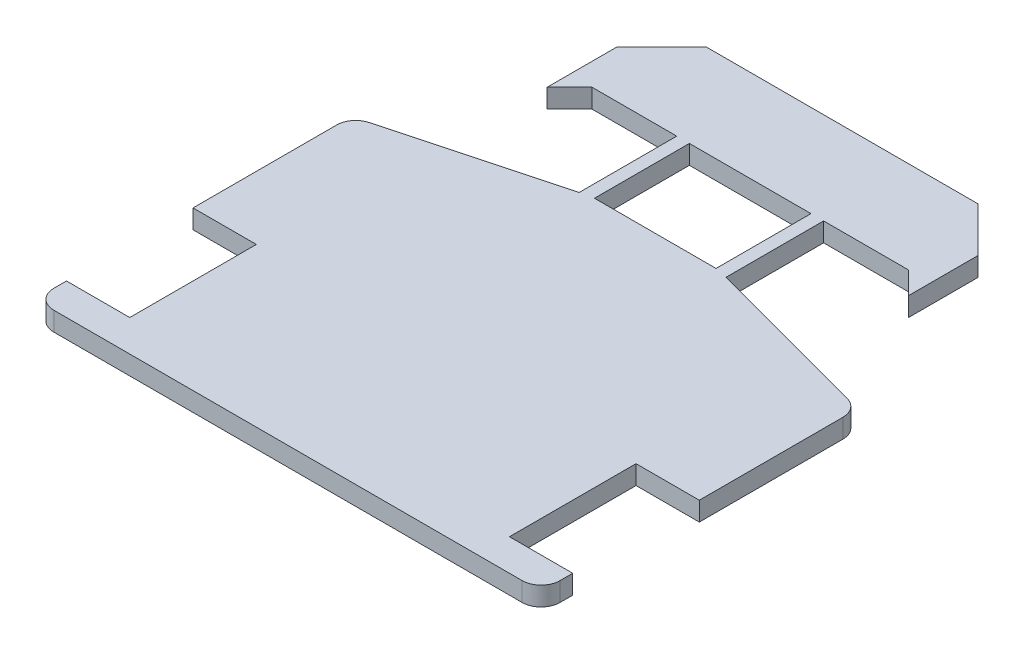
ISO-10303-21;
HEADER;
FILE_DESCRIPTION(('STEP AP214'),'2;1');
FILE_NAME('part.step','',(''),(''),'','','');
FILE_SCHEMA(('AUTOMOTIVE_DESIGN { 1 0 10303 214 1 1 1 1 }'));
ENDSEC;
DATA;
#1=APPLICATION_CONTEXT('core data for automotive mechanical design processes');
#2=APPLICATION_PROTOCOL_DEFINITION('international standard','automotive_design',2000,#1);
#3=PRODUCT_CONTEXT('',#1,'mechanical');
#4=PRODUCT('Part','Part','',(#3));
#5=PRODUCT_RELATED_PRODUCT_CATEGORY('part','',(#4));
#6=PRODUCT_DEFINITION_FORMATION('','',#4);
#7=PRODUCT_DEFINITION_CONTEXT('part definition',#1,'design');
#8=PRODUCT_DEFINITION('design','',#6,#7);
#9=PRODUCT_DEFINITION_SHAPE('','',#8);
#10=(LENGTH_UNIT() NAMED_UNIT(*) SI_UNIT(.MILLI.,.METRE.));
#11=(NAMED_UNIT(*) PLANE_ANGLE_UNIT() SI_UNIT($,.RADIAN.));
#12=(NAMED_UNIT(*) SI_UNIT($,.STERADIAN.) SOLID_ANGLE_UNIT());
#13=UNCERTAINTY_MEASURE_WITH_UNIT(LENGTH_MEASURE(1.E-05),#10,'distance_accuracy_value','');
#14=(GEOMETRIC_REPRESENTATION_CONTEXT(3) GLOBAL_UNCERTAINTY_ASSIGNED_CONTEXT((#13)) GLOBAL_UNIT_ASSIGNED_CONTEXT((#10,
#11,#12)) REPRESENTATION_CONTEXT('',''));
#15=CARTESIAN_POINT('',(0.,0.,0.));
#16=DIRECTION('',(0.,0.,1.));
#17=DIRECTION('',(1.,0.,0.));
#18=AXIS2_PLACEMENT_3D('',#15,#16,#17);
#19=CARTESIAN_POINT('',(15.1794919243108,3.,-56.6506350946109));
#20=DIRECTION('',(-0.258819045102514,0.,0.96592582628907));
#21=DIRECTION('',(0.96592582628907,0.,0.258819045102514));
#22=AXIS2_PLACEMENT_3D('',#19,#20,#21);
#23=PLANE('',#22);
#24=DIRECTION('',(0.,1.,0.));
#25=VECTOR('',#24,1.);
#26=CARTESIAN_POINT('',(11.6050425072378,0.,-57.6084059293014));
#27=LINE('',#26,#25);
#28=CARTESIAN_POINT('',(11.6050425072378,0.,-57.6084059293014));
#29=VERTEX_POINT('',#28);
#30=CARTESIAN_POINT('',(11.6050425072378,3.,-57.6084059293014));
#31=VERTEX_POINT('',#30);
#32=EDGE_CURVE('E395',#29,#31,#27,.T.);
#33=ORIENTED_EDGE('',*,*,#32,.T.);
#34=DIRECTION('',(-0.96592582628907,0.,-0.258819045102514));
#35=VECTOR('',#34,1.);
#36=CARTESIAN_POINT('',(15.1794919243108,3.,-56.6506350946109));
#37=LINE('',#36,#35);
#38=CARTESIAN_POINT('',(37.7764571353075,3.,-50.5957965149303));
#39=VERTEX_POINT('',#38);
#40=EDGE_CURVE('E432',#39,#31,#37,.T.);
#41=ORIENTED_EDGE('',*,*,#40,.F.);
#42=DIRECTION('',(0.,-1.,0.));
#43=VECTOR('',#42,1.);
#44=CARTESIAN_POINT('',(37.7764571353075,3.,-50.5957965149303));
#45=LINE('',#44,#43);
#46=CARTESIAN_POINT('',(37.7764571353075,0.,-50.5957965149303));
#47=VERTEX_POINT('',#46);
#48=EDGE_CURVE('E564',#39,#47,#45,.T.);
#49=ORIENTED_EDGE('',*,*,#48,.T.);
#50=DIRECTION('',(-0.96592582628907,0.,-0.258819045102514));
#51=VECTOR('',#50,1.);
#52=CARTESIAN_POINT('',(15.1794919243108,0.,-56.6506350946109));
#53=LINE('',#52,#51);
#54=EDGE_CURVE('E495',#47,#29,#53,.T.);
#55=ORIENTED_EDGE('',*,*,#54,.T.);
#56=EDGE_LOOP('',(#33,#41,#49,#55));
#57=FACE_BOUND('',#56,.T.);
#58=ADVANCED_FACE('F41',(#57),#23,.F.);
#59=CARTESIAN_POINT('',(0.,3.,0.));
#60=DIRECTION('',(0.,0.,-1.));
#61=DIRECTION('',(-1.,0.,0.));
#62=AXIS2_PLACEMENT_3D('',#59,#60,#61);
#63=PLANE('',#62);
#64=DIRECTION('',(1.,0.,0.));
#65=VECTOR('',#64,1.);
#66=CARTESIAN_POINT('',(0.,0.,0.));
#67=LINE('',#66,#65);
#68=CARTESIAN_POINT('',(-37.,0.,0.));
#69=VERTEX_POINT('',#68);
#70=CARTESIAN_POINT('',(37.,0.,0.));
#71=VERTEX_POINT('',#70);
#72=EDGE_CURVE('E399',#69,#71,#67,.T.);
#73=ORIENTED_EDGE('',*,*,#72,.T.);
#74=DIRECTION('',(0.,-1.,0.));
#75=VECTOR('',#74,1.);
#76=CARTESIAN_POINT('',(37.,3.,0.));
#77=LINE('',#76,#75);
#78=CARTESIAN_POINT('',(37.,3.,0.));
#79=VERTEX_POINT('',#78);
#80=EDGE_CURVE('E11',#79,#71,#77,.T.);
#81=ORIENTED_EDGE('',*,*,#80,.F.);
#82=DIRECTION('',(1.,0.,0.));
#83=VECTOR('',#82,1.);
#84=CARTESIAN_POINT('',(0.,3.,0.));
#85=LINE('',#84,#83);
#86=CARTESIAN_POINT('',(-37.,3.,0.));
#87=VERTEX_POINT('',#86);
#88=EDGE_CURVE('E406',#87,#79,#85,.T.);
#89=ORIENTED_EDGE('',*,*,#88,.F.);
#90=DIRECTION('',(0.,-1.,0.));
#91=VECTOR('',#90,1.);
#92=CARTESIAN_POINT('',(-37.,3.,0.));
#93=LINE('',#92,#91);
#94=EDGE_CURVE('E470',#87,#69,#93,.T.);
#95=ORIENTED_EDGE('',*,*,#94,.T.);
#96=EDGE_LOOP('',(#73,#81,#89,#95));
#97=FACE_BOUND('',#96,.T.);
#98=ADVANCED_FACE('F43',(#97),#63,.F.);
#99=CARTESIAN_POINT('',(37.,3.,-3.));
#100=DIRECTION('',(0.,-1.,0.));
#101=DIRECTION('',(0.,0.,-1.));
#102=AXIS2_PLACEMENT_3D('',#99,#100,#101);
#103=CYLINDRICAL_SURFACE('',#102,3.);
#104=CARTESIAN_POINT('',(37.,0.,-3.));
#105=DIRECTION('',(0.,1.,0.));
#106=DIRECTION('',(0.,0.,1.));
#107=AXIS2_PLACEMENT_3D('',#104,#105,#106);
#108=CIRCLE('',#107,3.);
#109=CARTESIAN_POINT('',(40.,0.,-3.00000000000002));
#110=VERTEX_POINT('',#109);
#111=EDGE_CURVE('E474',#71,#110,#108,.T.);
#112=ORIENTED_EDGE('',*,*,#111,.T.);
#113=DIRECTION('',(0.,-1.,0.));
#114=VECTOR('',#113,1.);
#115=CARTESIAN_POINT('',(40.,3.,-3.00000000000002));
#116=LINE('',#115,#114);
#117=CARTESIAN_POINT('',(40.,3.,-3.00000000000002));
#118=VERTEX_POINT('',#117);
#119=EDGE_CURVE('E50',#118,#110,#116,.T.);
#120=ORIENTED_EDGE('',*,*,#119,.F.);
#121=CARTESIAN_POINT('',(37.,3.,-3.));
#122=DIRECTION('',(0.,1.,0.));
#123=DIRECTION('',(0.,0.,1.));
#124=AXIS2_PLACEMENT_3D('',#121,#122,#123);
#125=CIRCLE('',#124,3.);
#126=EDGE_CURVE('E410',#79,#118,#125,.T.);
#127=ORIENTED_EDGE('',*,*,#126,.F.);
#128=ORIENTED_EDGE('',*,*,#80,.T.);
#129=EDGE_LOOP('',(#112,#120,#127,#128));
#130=FACE_BOUND('',#129,.T.);
#131=ADVANCED_FACE('F616',(#130),#103,.T.);
#132=CARTESIAN_POINT('',(40.,3.,0.));
#133=DIRECTION('',(-1.,0.,0.));
#134=DIRECTION('',(0.,0.,1.));
#135=AXIS2_PLACEMENT_3D('',#132,#133,#134);
#136=PLANE('',#135);
#137=DIRECTION('',(0.,0.,-1.));
#138=VECTOR('',#137,1.);
#139=CARTESIAN_POINT('',(40.,0.,0.));
#140=LINE('',#139,#138);
#141=CARTESIAN_POINT('',(40.,0.,-5.));
#142=VERTEX_POINT('',#141);
#143=EDGE_CURVE('E477',#110,#142,#140,.T.);
#144=ORIENTED_EDGE('',*,*,#143,.T.);
#145=DIRECTION('',(0.,-1.,0.));
#146=VECTOR('',#145,1.);
#147=CARTESIAN_POINT('',(40.,3.,-5.));
#148=LINE('',#147,#146);
#149=CARTESIAN_POINT('',(40.,3.,-5.));
#150=VERTEX_POINT('',#149);
#151=EDGE_CURVE('E584',#150,#142,#148,.T.);
#152=ORIENTED_EDGE('',*,*,#151,.F.);
#153=DIRECTION('',(0.,0.,-1.));
#154=VECTOR('',#153,1.);
#155=CARTESIAN_POINT('',(40.,3.,0.));
#156=LINE('',#155,#154);
#157=EDGE_CURVE('E414',#118,#150,#156,.T.);
#158=ORIENTED_EDGE('',*,*,#157,.F.);
#159=ORIENTED_EDGE('',*,*,#119,.T.);
#160=EDGE_LOOP('',(#144,#152,#158,#159));
#161=FACE_BOUND('',#160,.T.);
#162=ADVANCED_FACE('F593',(#161),#136,.F.);
#163=CARTESIAN_POINT('',(0.,3.,-4.99999999999999));
#164=DIRECTION('',(0.,0.,1.));
#165=DIRECTION('',(1.,0.,0.));
#166=AXIS2_PLACEMENT_3D('',#163,#164,#165);
#167=PLANE('',#166);
#168=DIRECTION('',(-1.,0.,0.));
#169=VECTOR('',#168,1.);
#170=CARTESIAN_POINT('',(0.,0.,-4.99999999999999));
#171=LINE('',#170,#169);
#172=CARTESIAN_POINT('',(30.,0.,-4.99999999999999));
#173=VERTEX_POINT('',#172);
#174=EDGE_CURVE('E480',#142,#173,#171,.T.);
#175=ORIENTED_EDGE('',*,*,#174,.T.);
#176=DIRECTION('',(0.,-1.,0.));
#177=VECTOR('',#176,1.);
#178=CARTESIAN_POINT('',(30.,3.,-4.99999999999999));
#179=LINE('',#178,#177);
#180=CARTESIAN_POINT('',(30.,3.,-4.99999999999999));
#181=VERTEX_POINT('',#180);
#182=EDGE_CURVE('E580',#181,#173,#179,.T.);
#183=ORIENTED_EDGE('',*,*,#182,.F.);
#184=DIRECTION('',(-1.,0.,0.));
#185=VECTOR('',#184,1.);
#186=CARTESIAN_POINT('',(0.,3.,-4.99999999999999));
#187=LINE('',#186,#185);
#188=EDGE_CURVE('E417',#150,#181,#187,.T.);
#189=ORIENTED_EDGE('',*,*,#188,.F.);
#190=ORIENTED_EDGE('',*,*,#151,.T.);
#191=EDGE_LOOP('',(#175,#183,#189,#190));
#192=FACE_BOUND('',#191,.T.);
#193=ADVANCED_FACE('F602',(#192),#167,.F.);
#194=CARTESIAN_POINT('',(30.,3.,0.));
#195=DIRECTION('',(-1.,0.,0.));
#196=DIRECTION('',(0.,0.,1.));
#197=AXIS2_PLACEMENT_3D('',#194,#195,#196);
#198=PLANE('',#197);
#199=DIRECTION('',(0.,0.,-1.));
#200=VECTOR('',#199,1.);
#201=CARTESIAN_POINT('',(30.,0.,0.));
#202=LINE('',#201,#200);
#203=CARTESIAN_POINT('',(30.,0.,-25.));
#204=VERTEX_POINT('',#203);
#205=EDGE_CURVE('E483',#173,#204,#202,.T.);
#206=ORIENTED_EDGE('',*,*,#205,.T.);
#207=DIRECTION('',(0.,-1.,0.));
#208=VECTOR('',#207,1.);
#209=CARTESIAN_POINT('',(30.,3.,-25.));
#210=LINE('',#209,#208);
#211=CARTESIAN_POINT('',(30.,3.,-25.));
#212=VERTEX_POINT('',#211);
#213=EDGE_CURVE('E576',#212,#204,#210,.T.);
#214=ORIENTED_EDGE('',*,*,#213,.F.);
#215=DIRECTION('',(0.,0.,-1.));
#216=VECTOR('',#215,1.);
#217=CARTESIAN_POINT('',(30.,3.,0.));
#218=LINE('',#217,#216);
#219=EDGE_CURVE('E420',#181,#212,#218,.T.);
#220=ORIENTED_EDGE('',*,*,#219,.F.);
#221=ORIENTED_EDGE('',*,*,#182,.T.);
#222=EDGE_LOOP('',(#206,#214,#220,#221));
#223=FACE_BOUND('',#222,.T.);
#224=ADVANCED_FACE('F606',(#223),#198,.F.);
#225=CARTESIAN_POINT('',(0.,3.,-25.));
#226=DIRECTION('',(0.,0.,-1.));
#227=DIRECTION('',(-1.,0.,0.));
#228=AXIS2_PLACEMENT_3D('',#225,#226,#227);
#229=PLANE('',#228);
#230=DIRECTION('',(1.,0.,0.));
#231=VECTOR('',#230,1.);
#232=CARTESIAN_POINT('',(0.,0.,-25.));
#233=LINE('',#232,#231);
#234=CARTESIAN_POINT('',(40.,0.,-25.));
#235=VERTEX_POINT('',#234);
#236=EDGE_CURVE('E486',#204,#235,#233,.T.);
#237=ORIENTED_EDGE('',*,*,#236,.T.);
#238=DIRECTION('',(0.,-1.,0.));
#239=VECTOR('',#238,1.);
#240=CARTESIAN_POINT('',(40.,3.,-25.));
#241=LINE('',#240,#239);
#242=CARTESIAN_POINT('',(40.,3.,-25.));
#243=VERTEX_POINT('',#242);
#244=EDGE_CURVE('E572',#243,#235,#241,.T.);
#245=ORIENTED_EDGE('',*,*,#244,.F.);
#246=DIRECTION('',(1.,0.,0.));
#247=VECTOR('',#246,1.);
#248=CARTESIAN_POINT('',(0.,3.,-25.));
#249=LINE('',#248,#247);
#250=EDGE_CURVE('E423',#212,#243,#249,.T.);
#251=ORIENTED_EDGE('',*,*,#250,.F.);
#252=ORIENTED_EDGE('',*,*,#213,.T.);
#253=EDGE_LOOP('',(#237,#245,#251,#252));
#254=FACE_BOUND('',#253,.T.);
#255=ADVANCED_FACE('F716',(#254),#229,.F.);
#256=CARTESIAN_POINT('',(40.,3.,0.));
#257=DIRECTION('',(-1.,0.,0.));
#258=DIRECTION('',(0.,0.,1.));
#259=AXIS2_PLACEMENT_3D('',#256,#257,#258);
#260=PLANE('',#259);
#261=DIRECTION('',(0.,0.,-1.));
#262=VECTOR('',#261,1.);
#263=CARTESIAN_POINT('',(40.,0.,0.));
#264=LINE('',#263,#262);
#265=CARTESIAN_POINT('',(40.,0.,-47.6980190360631));
#266=VERTEX_POINT('',#265);
#267=EDGE_CURVE('E489',#235,#266,#264,.T.);
#268=ORIENTED_EDGE('',*,*,#267,.T.);
#269=DIRECTION('',(0.,-1.,0.));
#270=VECTOR('',#269,1.);
#271=CARTESIAN_POINT('',(40.,3.,-47.6980190360631));
#272=LINE('',#271,#270);
#273=CARTESIAN_POINT('',(40.,3.,-47.6980190360631));
#274=VERTEX_POINT('',#273);
#275=EDGE_CURVE('E568',#274,#266,#272,.T.);
#276=ORIENTED_EDGE('',*,*,#275,.F.);
#277=DIRECTION('',(0.,0.,-1.));
#278=VECTOR('',#277,1.);
#279=CARTESIAN_POINT('',(40.,3.,0.));
#280=LINE('',#279,#278);
#281=EDGE_CURVE('E426',#243,#274,#280,.T.);
#282=ORIENTED_EDGE('',*,*,#281,.F.);
#283=ORIENTED_EDGE('',*,*,#244,.T.);
#284=EDGE_LOOP('',(#268,#276,#282,#283));
#285=FACE_BOUND('',#284,.T.);
#286=ADVANCED_FACE('F704',(#285),#260,.F.);
#287=CARTESIAN_POINT('',(37.,3.,-47.6980190360631));
#288=DIRECTION('',(0.,-1.,0.));
#289=DIRECTION('',(0.,0.,-1.));
#290=AXIS2_PLACEMENT_3D('',#287,#288,#289);
#291=CYLINDRICAL_SURFACE('',#290,3.);
#292=CARTESIAN_POINT('',(37.,0.,-47.6980190360631));
#293=DIRECTION('',(0.,1.,0.));
#294=DIRECTION('',(0.,0.,1.));
#295=AXIS2_PLACEMENT_3D('',#292,#293,#294);
#296=CIRCLE('',#295,3.);
#297=EDGE_CURVE('E492',#266,#47,#296,.T.);
#298=ORIENTED_EDGE('',*,*,#297,.T.);
#299=ORIENTED_EDGE('',*,*,#48,.F.);
#300=CARTESIAN_POINT('',(37.,3.,-47.6980190360631));
#301=DIRECTION('',(0.,1.,0.));
#302=DIRECTION('',(0.,0.,1.));
#303=AXIS2_PLACEMENT_3D('',#300,#301,#302);
#304=CIRCLE('',#303,3.);
#305=EDGE_CURVE('E429',#274,#39,#304,.T.);
#306=ORIENTED_EDGE('',*,*,#305,.F.);
#307=ORIENTED_EDGE('',*,*,#275,.T.);
#308=EDGE_LOOP('',(#298,#299,#306,#307));
#309=FACE_BOUND('',#308,.T.);
#310=ADVANCED_FACE('F697',(#309),#291,.T.);
#311=CARTESIAN_POINT('',(0.,3.,-58.0384757729335));
#312=DIRECTION('',(0.,0.,-1.));
#313=DIRECTION('',(-1.,0.,0.));
#314=AXIS2_PLACEMENT_3D('',#311,#312,#313);
#315=PLANE('',#314);
#316=DIRECTION('',(1.,0.,0.));
#317=VECTOR('',#316,1.);
#318=CARTESIAN_POINT('',(0.,0.,-58.0384757729335));
#319=LINE('',#318,#317);
#320=CARTESIAN_POINT('',(-9.60504250723781,0.,-58.0384757729335));
#321=VERTEX_POINT('',#320);
#322=CARTESIAN_POINT('',(9.60504250723781,0.,-58.0384757729335));
#323=VERTEX_POINT('',#322);
#324=EDGE_CURVE('E499',#321,#323,#319,.T.);
#325=ORIENTED_EDGE('',*,*,#324,.F.);
#326=DIRECTION('',(0.,-1.,0.));
#327=VECTOR('',#326,1.);
#328=CARTESIAN_POINT('',(-9.60504250723781,3.,-58.0384757729335));
#329=LINE('',#328,#327);
#330=CARTESIAN_POINT('',(-9.60504250723781,3.,-58.0384757729335));
#331=VERTEX_POINT('',#330);
#332=EDGE_CURVE('E556',#331,#321,#329,.T.);
#333=ORIENTED_EDGE('',*,*,#332,.F.);
#334=DIRECTION('',(1.,0.,0.));
#335=VECTOR('',#334,1.);
#336=CARTESIAN_POINT('',(0.,3.,-58.0384757729335));
#337=LINE('',#336,#335);
#338=CARTESIAN_POINT('',(9.60504250723781,3.,-58.0384757729335));
#339=VERTEX_POINT('',#338);
#340=EDGE_CURVE('E436',#331,#339,#337,.T.);
#341=ORIENTED_EDGE('',*,*,#340,.T.);
#342=DIRECTION('',(0.,-1.,0.));
#343=VECTOR('',#342,1.);
#344=CARTESIAN_POINT('',(9.60504250723781,3.,-58.0384757729335));
#345=LINE('',#344,#343);
#346=EDGE_CURVE('E560',#339,#323,#345,.T.);
#347=ORIENTED_EDGE('',*,*,#346,.T.);
#348=EDGE_LOOP('',(#325,#333,#341,#347));
#349=FACE_BOUND('',#348,.T.);
#350=ADVANCED_FACE('F695',(#349),#315,.T.);
#351=CARTESIAN_POINT('',(-15.1794919243108,3.,-56.6506350946109));
#352=DIRECTION('',(-0.258819045102514,0.,-0.96592582628907));
#353=DIRECTION('',(-0.96592582628907,0.,0.258819045102514));
#354=AXIS2_PLACEMENT_3D('',#351,#352,#353);
#355=PLANE('',#354);
#356=DIRECTION('',(0.,1.,0.));
#357=VECTOR('',#356,1.);
#358=CARTESIAN_POINT('',(-11.6050425072378,0.,-57.6084059293015));
#359=LINE('',#358,#357);
#360=CARTESIAN_POINT('',(-11.6050425072378,0.,-57.6084059293014));
#361=VERTEX_POINT('',#360);
#362=CARTESIAN_POINT('',(-11.6050425072378,3.,-57.6084059293014));
#363=VERTEX_POINT('',#362);
#364=EDGE_CURVE('E61',#361,#363,#359,.T.);
#365=ORIENTED_EDGE('',*,*,#364,.F.);
#366=DIRECTION('',(0.96592582628907,0.,-0.258819045102514));
#367=VECTOR('',#366,1.);
#368=CARTESIAN_POINT('',(-15.1794919243108,0.,-56.6506350946109));
#369=LINE('',#368,#367);
#370=CARTESIAN_POINT('',(-37.7764571353075,0.,-50.5957965149303));
#371=VERTEX_POINT('',#370);
#372=EDGE_CURVE('E503',#371,#361,#369,.T.);
#373=ORIENTED_EDGE('',*,*,#372,.F.);
#374=DIRECTION('',(0.,-1.,0.));
#375=VECTOR('',#374,1.);
#376=CARTESIAN_POINT('',(-37.7764571353075,3.,-50.5957965149303));
#377=LINE('',#376,#375);
#378=CARTESIAN_POINT('',(-37.7764571353075,3.,-50.5957965149303));
#379=VERTEX_POINT('',#378);
#380=EDGE_CURVE('E553',#379,#371,#377,.T.);
#381=ORIENTED_EDGE('',*,*,#380,.F.);
#382=DIRECTION('',(0.96592582628907,0.,-0.258819045102514));
#383=VECTOR('',#382,1.);
#384=CARTESIAN_POINT('',(-15.1794919243108,3.,-56.6506350946109));
#385=LINE('',#384,#383);
#386=EDGE_CURVE('E57',#379,#363,#385,.T.);
#387=ORIENTED_EDGE('',*,*,#386,.T.);
#388=EDGE_LOOP('',(#365,#373,#381,#387));
#389=FACE_BOUND('',#388,.T.);
#390=ADVANCED_FACE('F645',(#389),#355,.T.);
#391=CARTESIAN_POINT('',(-37.,3.,-47.6980190360631));
#392=DIRECTION('',(0.,-1.,0.));
#393=DIRECTION('',(0.,0.,-1.));
#394=AXIS2_PLACEMENT_3D('',#391,#392,#393);
#395=CYLINDRICAL_SURFACE('',#394,3.);
#396=CARTESIAN_POINT('',(-37.,0.,-47.6980190360631));
#397=DIRECTION('',(0.,1.,0.));
#398=DIRECTION('',(0.,0.,1.));
#399=AXIS2_PLACEMENT_3D('',#396,#397,#398);
#400=CIRCLE('',#399,3.);
#401=CARTESIAN_POINT('',(-40.,0.,-47.6980190360631));
#402=VERTEX_POINT('',#401);
#403=EDGE_CURVE('E506',#402,#371,#400,.F.);
#404=ORIENTED_EDGE('',*,*,#403,.F.);
#405=DIRECTION('',(0.,-1.,0.));
#406=VECTOR('',#405,1.);
#407=CARTESIAN_POINT('',(-40.,3.,-47.6980190360631));
#408=LINE('',#407,#406);
#409=CARTESIAN_POINT('',(-40.,3.,-47.6980190360631));
#410=VERTEX_POINT('',#409);
#411=EDGE_CURVE('E550',#410,#402,#408,.T.);
#412=ORIENTED_EDGE('',*,*,#411,.F.);
#413=CARTESIAN_POINT('',(-37.,3.,-47.6980190360631));
#414=DIRECTION('',(0.,1.,0.));
#415=DIRECTION('',(0.,0.,1.));
#416=AXIS2_PLACEMENT_3D('',#413,#414,#415);
#417=CIRCLE('',#416,3.);
#418=EDGE_CURVE('E442',#410,#379,#417,.F.);
#419=ORIENTED_EDGE('',*,*,#418,.T.);
#420=ORIENTED_EDGE('',*,*,#380,.T.);
#421=EDGE_LOOP('',(#404,#412,#419,#420));
#422=FACE_BOUND('',#421,.T.);
#423=ADVANCED_FACE('F644',(#422),#395,.T.);
#424=CARTESIAN_POINT('',(-40.,3.,0.));
#425=DIRECTION('',(-1.,0.,0.));
#426=DIRECTION('',(0.,0.,1.));
#427=AXIS2_PLACEMENT_3D('',#424,#425,#426);
#428=PLANE('',#427);
#429=DIRECTION('',(0.,0.,-1.));
#430=VECTOR('',#429,1.);
#431=CARTESIAN_POINT('',(-40.,0.,0.));
#432=LINE('',#431,#430);
#433=CARTESIAN_POINT('',(-40.,0.,-25.));
#434=VERTEX_POINT('',#433);
#435=EDGE_CURVE('E510',#434,#402,#432,.T.);
#436=ORIENTED_EDGE('',*,*,#435,.F.);
#437=DIRECTION('',(0.,-1.,0.));
#438=VECTOR('',#437,1.);
#439=CARTESIAN_POINT('',(-40.,3.,-25.));
#440=LINE('',#439,#438);
#441=CARTESIAN_POINT('',(-40.,3.,-25.));
#442=VERTEX_POINT('',#441);
#443=EDGE_CURVE('E547',#442,#434,#440,.T.);
#444=ORIENTED_EDGE('',*,*,#443,.F.);
#445=DIRECTION('',(0.,0.,-1.));
#446=VECTOR('',#445,1.);
#447=CARTESIAN_POINT('',(-40.,3.,0.));
#448=LINE('',#447,#446);
#449=EDGE_CURVE('E446',#442,#410,#448,.T.);
#450=ORIENTED_EDGE('',*,*,#449,.T.);
#451=ORIENTED_EDGE('',*,*,#411,.T.);
#452=EDGE_LOOP('',(#436,#444,#450,#451));
#453=FACE_BOUND('',#452,.T.);
#454=ADVANCED_FACE('F640',(#453),#428,.T.);
#455=CARTESIAN_POINT('',(0.,3.,-25.));
#456=DIRECTION('',(0.,0.,1.));
#457=DIRECTION('',(1.,0.,0.));
#458=AXIS2_PLACEMENT_3D('',#455,#456,#457);
#459=PLANE('',#458);
#460=DIRECTION('',(-1.,0.,0.));
#461=VECTOR('',#460,1.);
#462=CARTESIAN_POINT('',(0.,0.,-25.));
#463=LINE('',#462,#461);
#464=CARTESIAN_POINT('',(-30.,0.,-25.));
#465=VERTEX_POINT('',#464);
#466=EDGE_CURVE('E514',#465,#434,#463,.T.);
#467=ORIENTED_EDGE('',*,*,#466,.F.);
#468=DIRECTION('',(0.,-1.,0.));
#469=VECTOR('',#468,1.);
#470=CARTESIAN_POINT('',(-30.,3.,-25.));
#471=LINE('',#470,#469);
#472=CARTESIAN_POINT('',(-30.,3.,-25.));
#473=VERTEX_POINT('',#472);
#474=EDGE_CURVE('E544',#473,#465,#471,.T.);
#475=ORIENTED_EDGE('',*,*,#474,.F.);
#476=DIRECTION('',(-1.,0.,0.));
#477=VECTOR('',#476,1.);
#478=CARTESIAN_POINT('',(0.,3.,-25.));
#479=LINE('',#478,#477);
#480=EDGE_CURVE('E450',#473,#442,#479,.T.);
#481=ORIENTED_EDGE('',*,*,#480,.T.);
#482=ORIENTED_EDGE('',*,*,#443,.T.);
#483=EDGE_LOOP('',(#467,#475,#481,#482));
#484=FACE_BOUND('',#483,.T.);
#485=ADVANCED_FACE('F636',(#484),#459,.T.);
#486=CARTESIAN_POINT('',(-30.,3.,0.));
#487=DIRECTION('',(-1.,0.,0.));
#488=DIRECTION('',(0.,0.,1.));
#489=AXIS2_PLACEMENT_3D('',#486,#487,#488);
#490=PLANE('',#489);
#491=DIRECTION('',(0.,0.,-1.));
#492=VECTOR('',#491,1.);
#493=CARTESIAN_POINT('',(-30.,0.,0.));
#494=LINE('',#493,#492);
#495=CARTESIAN_POINT('',(-30.,0.,-4.99999999999999));
#496=VERTEX_POINT('',#495);
#497=EDGE_CURVE('E518',#496,#465,#494,.T.);
#498=ORIENTED_EDGE('',*,*,#497,.F.);
#499=DIRECTION('',(0.,-1.,0.));
#500=VECTOR('',#499,1.);
#501=CARTESIAN_POINT('',(-30.,3.,-4.99999999999999));
#502=LINE('',#501,#500);
#503=CARTESIAN_POINT('',(-30.,3.,-4.99999999999999));
#504=VERTEX_POINT('',#503);
#505=EDGE_CURVE('E541',#504,#496,#502,.T.);
#506=ORIENTED_EDGE('',*,*,#505,.F.);
#507=DIRECTION('',(0.,0.,-1.));
#508=VECTOR('',#507,1.);
#509=CARTESIAN_POINT('',(-30.,3.,0.));
#510=LINE('',#509,#508);
#511=EDGE_CURVE('E454',#504,#473,#510,.T.);
#512=ORIENTED_EDGE('',*,*,#511,.T.);
#513=ORIENTED_EDGE('',*,*,#474,.T.);
#514=EDGE_LOOP('',(#498,#506,#512,#513));
#515=FACE_BOUND('',#514,.T.);
#516=ADVANCED_FACE('F632',(#515),#490,.T.);
#517=CARTESIAN_POINT('',(0.,3.,-4.99999999999999));
#518=DIRECTION('',(0.,0.,-1.));
#519=DIRECTION('',(-1.,0.,0.));
#520=AXIS2_PLACEMENT_3D('',#517,#518,#519);
#521=PLANE('',#520);
#522=DIRECTION('',(1.,0.,0.));
#523=VECTOR('',#522,1.);
#524=CARTESIAN_POINT('',(0.,0.,-4.99999999999999));
#525=LINE('',#524,#523);
#526=CARTESIAN_POINT('',(-40.,0.,-4.99999999999999));
#527=VERTEX_POINT('',#526);
#528=EDGE_CURVE('E522',#527,#496,#525,.T.);
#529=ORIENTED_EDGE('',*,*,#528,.F.);
#530=DIRECTION('',(0.,-1.,0.));
#531=VECTOR('',#530,1.);
#532=CARTESIAN_POINT('',(-40.,3.,-4.99999999999999));
#533=LINE('',#532,#531);
#534=CARTESIAN_POINT('',(-40.,3.,-4.99999999999999));
#535=VERTEX_POINT('',#534);
#536=EDGE_CURVE('E538',#535,#527,#533,.T.);
#537=ORIENTED_EDGE('',*,*,#536,.F.);
#538=DIRECTION('',(1.,0.,0.));
#539=VECTOR('',#538,1.);
#540=CARTESIAN_POINT('',(0.,3.,-4.99999999999999));
#541=LINE('',#540,#539);
#542=EDGE_CURVE('E458',#535,#504,#541,.T.);
#543=ORIENTED_EDGE('',*,*,#542,.T.);
#544=ORIENTED_EDGE('',*,*,#505,.T.);
#545=EDGE_LOOP('',(#529,#537,#543,#544));
#546=FACE_BOUND('',#545,.T.);
#547=ADVANCED_FACE('F628',(#546),#521,.T.);
#548=CARTESIAN_POINT('',(-40.,3.,0.));
#549=DIRECTION('',(-1.,0.,0.));
#550=DIRECTION('',(0.,0.,1.));
#551=AXIS2_PLACEMENT_3D('',#548,#549,#550);
#552=PLANE('',#551);
#553=DIRECTION('',(0.,0.,-1.));
#554=VECTOR('',#553,1.);
#555=CARTESIAN_POINT('',(-40.,0.,0.));
#556=LINE('',#555,#554);
#557=CARTESIAN_POINT('',(-40.,0.,-3.00000000000002));
#558=VERTEX_POINT('',#557);
#559=EDGE_CURVE('E526',#558,#527,#556,.T.);
#560=ORIENTED_EDGE('',*,*,#559,.F.);
#561=DIRECTION('',(0.,-1.,0.));
#562=VECTOR('',#561,1.);
#563=CARTESIAN_POINT('',(-40.,3.,-3.00000000000002));
#564=LINE('',#563,#562);
#565=CARTESIAN_POINT('',(-40.,3.,-3.00000000000002));
#566=VERTEX_POINT('',#565);
#567=EDGE_CURVE('E535',#566,#558,#564,.T.);
#568=ORIENTED_EDGE('',*,*,#567,.F.);
#569=DIRECTION('',(0.,0.,-1.));
#570=VECTOR('',#569,1.);
#571=CARTESIAN_POINT('',(-40.,3.,0.));
#572=LINE('',#571,#570);
#573=EDGE_CURVE('E462',#566,#535,#572,.T.);
#574=ORIENTED_EDGE('',*,*,#573,.T.);
#575=ORIENTED_EDGE('',*,*,#536,.T.);
#576=EDGE_LOOP('',(#560,#568,#574,#575));
#577=FACE_BOUND('',#576,.T.);
#578=ADVANCED_FACE('F624',(#577),#552,.T.);
#579=CARTESIAN_POINT('',(-37.,3.,-3.));
#580=DIRECTION('',(0.,-1.,0.));
#581=DIRECTION('',(0.,0.,-1.));
#582=AXIS2_PLACEMENT_3D('',#579,#580,#581);
#583=CYLINDRICAL_SURFACE('',#582,3.);
#584=CARTESIAN_POINT('',(-37.,0.,-3.));
#585=DIRECTION('',(0.,1.,0.));
#586=DIRECTION('',(0.,0.,1.));
#587=AXIS2_PLACEMENT_3D('',#584,#585,#586);
#588=CIRCLE('',#587,3.);
#589=EDGE_CURVE('E411',#69,#558,#588,.F.);
#590=ORIENTED_EDGE('',*,*,#589,.F.);
#591=ORIENTED_EDGE('',*,*,#94,.F.);
#592=CARTESIAN_POINT('',(-37.,3.,-3.));
#593=DIRECTION('',(0.,1.,0.));
#594=DIRECTION('',(0.,0.,1.));
#595=AXIS2_PLACEMENT_3D('',#592,#593,#594);
#596=CIRCLE('',#595,3.);
#597=EDGE_CURVE('E466',#87,#566,#596,.F.);
#598=ORIENTED_EDGE('',*,*,#597,.T.);
#599=ORIENTED_EDGE('',*,*,#567,.T.);
#600=EDGE_LOOP('',(#590,#591,#598,#599));
#601=FACE_BOUND('',#600,.T.);
#602=ADVANCED_FACE('F620',(#601),#583,.T.);
#603=CARTESIAN_POINT('',(0.,3.,0.));
#604=DIRECTION('',(0.,1.,0.));
#605=DIRECTION('',(0.,0.,1.));
#606=AXIS2_PLACEMENT_3D('',#603,#604,#605);
#607=PLANE('',#606);
#608=DIRECTION('',(0.,0.,1.));
#609=VECTOR('',#608,1.);
#610=CARTESIAN_POINT('',(11.6050425072378,3.,0.));
#611=LINE('',#610,#609);
#612=CARTESIAN_POINT('',(11.6050425072378,3.,-73.0384757729335));
#613=VERTEX_POINT('',#612);
#614=EDGE_CURVE('E377',#613,#31,#611,.T.);
#615=ORIENTED_EDGE('',*,*,#614,.F.);
#616=DIRECTION('',(1.,0.,0.));
#617=VECTOR('',#616,1.);
#618=CARTESIAN_POINT('',(0.,3.,-73.0384757729335));
#619=LINE('',#618,#617);
#620=CARTESIAN_POINT('',(25.,3.,-73.0384757729335));
#621=VERTEX_POINT('',#620);
#622=EDGE_CURVE('E333',#613,#621,#619,.T.);
#623=ORIENTED_EDGE('',*,*,#622,.T.);
#624=DIRECTION('',(0.707106781186546,0.,0.707106781186549));
#625=VECTOR('',#624,1.);
#626=CARTESIAN_POINT('',(25.,3.,-73.0384757729335));
#627=LINE('',#626,#625);
#628=CARTESIAN_POINT('',(28.5355339059327,3.,-69.5029418670007));
#629=VERTEX_POINT('',#628);
#630=EDGE_CURVE('E271',#621,#629,#627,.T.);
#631=ORIENTED_EDGE('',*,*,#630,.T.);
#632=DIRECTION('',(0.,0.,-1.));
#633=VECTOR('',#632,1.);
#634=CARTESIAN_POINT('',(28.5355339059327,3.,-69.5029418670007));
#635=LINE('',#634,#633);
#636=CARTESIAN_POINT('',(28.5355339059327,3.,-80.5029418670007));
#637=VERTEX_POINT('',#636);
#638=EDGE_CURVE('E309',#629,#637,#635,.T.);
#639=ORIENTED_EDGE('',*,*,#638,.T.);
#640=DIRECTION('',(-0.707106781186547,0.,-0.707106781186548));
#641=VECTOR('',#640,1.);
#642=CARTESIAN_POINT('',(28.5355339059327,3.,-80.5029418670007));
#643=LINE('',#642,#641);
#644=CARTESIAN_POINT('',(21.4644660940673,3.,-87.5740096788662));
#645=VERTEX_POINT('',#644);
#646=EDGE_CURVE('E313',#637,#645,#643,.T.);
#647=ORIENTED_EDGE('',*,*,#646,.T.);
#648=DIRECTION('',(-1.,0.,0.));
#649=VECTOR('',#648,1.);
#650=CARTESIAN_POINT('',(-21.4644660940673,3.,-87.5740096788662));
#651=LINE('',#650,#649);
#652=CARTESIAN_POINT('',(-21.4644660940673,3.,-87.5740096788662));
#653=VERTEX_POINT('',#652);
#654=EDGE_CURVE('E317',#645,#653,#651,.T.);
#655=ORIENTED_EDGE('',*,*,#654,.T.);
#656=DIRECTION('',(-0.707106781186547,0.,0.707106781186548));
#657=VECTOR('',#656,1.);
#658=CARTESIAN_POINT('',(-28.5355339059327,3.,-80.5029418670007));
#659=LINE('',#658,#657);
#660=CARTESIAN_POINT('',(-28.5355339059327,3.,-80.5029418670007));
#661=VERTEX_POINT('',#660);
#662=EDGE_CURVE('E321',#653,#661,#659,.T.);
#663=ORIENTED_EDGE('',*,*,#662,.T.);
#664=DIRECTION('',(0.,0.,1.));
#665=VECTOR('',#664,1.);
#666=CARTESIAN_POINT('',(-28.5355339059327,3.,-69.5029418670007));
#667=LINE('',#666,#665);
#668=CARTESIAN_POINT('',(-28.5355339059327,3.,-69.5029418670007));
#669=VERTEX_POINT('',#668);
#670=EDGE_CURVE('E325',#661,#669,#667,.T.);
#671=ORIENTED_EDGE('',*,*,#670,.T.);
#672=DIRECTION('',(0.707106781186547,0.,-0.707106781186548));
#673=VECTOR('',#672,1.);
#674=CARTESIAN_POINT('',(-25.,3.,-73.0384757729335));
#675=LINE('',#674,#673);
#676=CARTESIAN_POINT('',(-25.,3.,-73.0384757729335));
#677=VERTEX_POINT('',#676);
#678=EDGE_CURVE('E329',#669,#677,#675,.T.);
#679=ORIENTED_EDGE('',*,*,#678,.T.);
#680=CARTESIAN_POINT('',(-11.6050425072378,3.,-73.0384757729335));
#681=VERTEX_POINT('',#680);
#682=EDGE_CURVE('E263',#677,#681,#619,.T.);
#683=ORIENTED_EDGE('',*,*,#682,.T.);
#684=DIRECTION('',(0.,0.,1.));
#685=VECTOR('',#684,1.);
#686=CARTESIAN_POINT('',(-11.6050425072378,3.,-73.0384757729335));
#687=LINE('',#686,#685);
#688=EDGE_CURVE('E368',#681,#363,#687,.T.);
#689=ORIENTED_EDGE('',*,*,#688,.T.);
#690=ORIENTED_EDGE('',*,*,#386,.F.);
#691=ORIENTED_EDGE('',*,*,#418,.F.);
#692=ORIENTED_EDGE('',*,*,#449,.F.);
#693=ORIENTED_EDGE('',*,*,#480,.F.);
#694=ORIENTED_EDGE('',*,*,#511,.F.);
#695=ORIENTED_EDGE('',*,*,#542,.F.);
#696=ORIENTED_EDGE('',*,*,#573,.F.);
#697=ORIENTED_EDGE('',*,*,#597,.F.);
#698=ORIENTED_EDGE('',*,*,#88,.T.);
#699=ORIENTED_EDGE('',*,*,#126,.T.);
#700=ORIENTED_EDGE('',*,*,#157,.T.);
#701=ORIENTED_EDGE('',*,*,#188,.T.);
#702=ORIENTED_EDGE('',*,*,#219,.T.);
#703=ORIENTED_EDGE('',*,*,#250,.T.);
#704=ORIENTED_EDGE('',*,*,#281,.T.);
#705=ORIENTED_EDGE('',*,*,#305,.T.);
#706=ORIENTED_EDGE('',*,*,#40,.T.);
#707=EDGE_LOOP('',(#615,#623,#631,#639,#647,#655,#663,#671,#679,#683,#689,#690,#691,#692,#693,
#694,#695,#696,#697,#698,#699,#700,#701,#702,#703,#704,#705,#706));
#708=FACE_BOUND('',#707,.T.);
#709=ORIENTED_EDGE('',*,*,#340,.F.);
#710=DIRECTION('',(0.,0.,-1.));
#711=VECTOR('',#710,1.);
#712=CARTESIAN_POINT('',(-9.60504250723781,3.,-58.0384757729335));
#713=LINE('',#712,#711);
#714=CARTESIAN_POINT('',(-9.60504250723782,3.,-73.0384757729335));
#715=VERTEX_POINT('',#714);
#716=EDGE_CURVE('E372',#331,#715,#713,.T.);
#717=ORIENTED_EDGE('',*,*,#716,.T.);
#718=CARTESIAN_POINT('',(9.60504250723781,3.,-73.0384757729335));
#719=VERTEX_POINT('',#718);
#720=EDGE_CURVE('E337',#715,#719,#619,.T.);
#721=ORIENTED_EDGE('',*,*,#720,.T.);
#722=DIRECTION('',(0.,0.,-1.));
#723=VECTOR('',#722,1.);
#724=CARTESIAN_POINT('',(9.60504250723781,3.,0.));
#725=LINE('',#724,#723);
#726=EDGE_CURVE('E388',#339,#719,#725,.T.);
#727=ORIENTED_EDGE('',*,*,#726,.F.);
#728=EDGE_LOOP('',(#709,#717,#721,#727));
#729=FACE_BOUND('',#728,.T.);
#730=ADVANCED_FACE('F610',(#708,#729),#607,.T.);
#731=CARTESIAN_POINT('',(0.,0.,0.));
#732=DIRECTION('',(0.,1.,0.));
#733=DIRECTION('',(0.,0.,1.));
#734=AXIS2_PLACEMENT_3D('',#731,#732,#733);
#735=PLANE('',#734);
#736=DIRECTION('',(1.,0.,0.));
#737=VECTOR('',#736,1.);
#738=CARTESIAN_POINT('',(0.,0.,-73.0384757729335));
#739=LINE('',#738,#737);
#740=CARTESIAN_POINT('',(11.6050425072378,0.,-73.0384757729335));
#741=VERTEX_POINT('',#740);
#742=CARTESIAN_POINT('',(25.,0.,-73.0384757729335));
#743=VERTEX_POINT('',#742);
#744=EDGE_CURVE('E251',#741,#743,#739,.T.);
#745=ORIENTED_EDGE('',*,*,#744,.F.);
#746=DIRECTION('',(0.,0.,1.));
#747=VECTOR('',#746,1.);
#748=CARTESIAN_POINT('',(11.6050425072378,0.,0.));
#749=LINE('',#748,#747);
#750=EDGE_CURVE('E384',#741,#29,#749,.T.);
#751=ORIENTED_EDGE('',*,*,#750,.T.);
#752=ORIENTED_EDGE('',*,*,#54,.F.);
#753=ORIENTED_EDGE('',*,*,#297,.F.);
#754=ORIENTED_EDGE('',*,*,#267,.F.);
#755=ORIENTED_EDGE('',*,*,#236,.F.);
#756=ORIENTED_EDGE('',*,*,#205,.F.);
#757=ORIENTED_EDGE('',*,*,#174,.F.);
#758=ORIENTED_EDGE('',*,*,#143,.F.);
#759=ORIENTED_EDGE('',*,*,#111,.F.);
#760=ORIENTED_EDGE('',*,*,#72,.F.);
#761=ORIENTED_EDGE('',*,*,#589,.T.);
#762=ORIENTED_EDGE('',*,*,#559,.T.);
#763=ORIENTED_EDGE('',*,*,#528,.T.);
#764=ORIENTED_EDGE('',*,*,#497,.T.);
#765=ORIENTED_EDGE('',*,*,#466,.T.);
#766=ORIENTED_EDGE('',*,*,#435,.T.);
#767=ORIENTED_EDGE('',*,*,#403,.T.);
#768=ORIENTED_EDGE('',*,*,#372,.T.);
#769=DIRECTION('',(0.,0.,1.));
#770=VECTOR('',#769,1.);
#771=CARTESIAN_POINT('',(-11.6050425072378,0.,-73.0384757729335));
#772=LINE('',#771,#770);
#773=CARTESIAN_POINT('',(-11.6050425072378,0.,-73.0384757729335));
#774=VERTEX_POINT('',#773);
#775=EDGE_CURVE('E362',#774,#361,#772,.T.);
#776=ORIENTED_EDGE('',*,*,#775,.F.);
#777=CARTESIAN_POINT('',(-25.,0.,-73.0384757729335));
#778=VERTEX_POINT('',#777);
#779=EDGE_CURVE('E265',#778,#774,#739,.T.);
#780=ORIENTED_EDGE('',*,*,#779,.F.);
#781=DIRECTION('',(0.707106781186547,0.,-0.707106781186548));
#782=VECTOR('',#781,1.);
#783=CARTESIAN_POINT('',(-25.,0.,-73.0384757729335));
#784=LINE('',#783,#782);
#785=CARTESIAN_POINT('',(-28.5355339059327,0.,-69.5029418670007));
#786=VERTEX_POINT('',#785);
#787=EDGE_CURVE('E274',#786,#778,#784,.T.);
#788=ORIENTED_EDGE('',*,*,#787,.F.);
#789=DIRECTION('',(0.,0.,1.));
#790=VECTOR('',#789,1.);
#791=CARTESIAN_POINT('',(-28.5355339059327,0.,-69.5029418670007));
#792=LINE('',#791,#790);
#793=CARTESIAN_POINT('',(-28.5355339059327,0.,-80.5029418670007));
#794=VERTEX_POINT('',#793);
#795=EDGE_CURVE('E300',#794,#786,#792,.T.);
#796=ORIENTED_EDGE('',*,*,#795,.F.);
#797=DIRECTION('',(-0.707106781186547,0.,0.707106781186548));
#798=VECTOR('',#797,1.);
#799=CARTESIAN_POINT('',(-28.5355339059327,0.,-80.5029418670007));
#800=LINE('',#799,#798);
#801=CARTESIAN_POINT('',(-21.4644660940673,0.,-87.5740096788662));
#802=VERTEX_POINT('',#801);
#803=EDGE_CURVE('E296',#802,#794,#800,.T.);
#804=ORIENTED_EDGE('',*,*,#803,.F.);
#805=DIRECTION('',(-1.,0.,0.));
#806=VECTOR('',#805,1.);
#807=CARTESIAN_POINT('',(-21.4644660940673,0.,-87.5740096788662));
#808=LINE('',#807,#806);
#809=CARTESIAN_POINT('',(21.4644660940673,0.,-87.5740096788662));
#810=VERTEX_POINT('',#809);
#811=EDGE_CURVE('E292',#810,#802,#808,.T.);
#812=ORIENTED_EDGE('',*,*,#811,.F.);
#813=DIRECTION('',(-0.707106781186547,0.,-0.707106781186548));
#814=VECTOR('',#813,1.);
#815=CARTESIAN_POINT('',(28.5355339059327,0.,-80.5029418670007));
#816=LINE('',#815,#814);
#817=CARTESIAN_POINT('',(28.5355339059327,0.,-80.5029418670007));
#818=VERTEX_POINT('',#817);
#819=EDGE_CURVE('E286',#818,#810,#816,.T.);
#820=ORIENTED_EDGE('',*,*,#819,.F.);
#821=DIRECTION('',(0.,0.,-1.));
#822=VECTOR('',#821,1.);
#823=CARTESIAN_POINT('',(28.5355339059327,0.,-69.5029418670007));
#824=LINE('',#823,#822);
#825=CARTESIAN_POINT('',(28.5355339059327,0.,-69.5029418670007));
#826=VERTEX_POINT('',#825);
#827=EDGE_CURVE('E281',#826,#818,#824,.T.);
#828=ORIENTED_EDGE('',*,*,#827,.F.);
#829=DIRECTION('',(0.707106781186546,0.,0.707106781186549));
#830=VECTOR('',#829,1.);
#831=CARTESIAN_POINT('',(25.,0.,-73.0384757729335));
#832=LINE('',#831,#830);
#833=EDGE_CURVE('E269',#743,#826,#832,.T.);
#834=ORIENTED_EDGE('',*,*,#833,.F.);
#835=EDGE_LOOP('',(#745,#751,#752,#753,#754,#755,#756,#757,#758,#759,#760,#761,#762,#763,#764,
#765,#766,#767,#768,#776,#780,#788,#796,#804,#812,#820,#828,#834));
#836=FACE_BOUND('',#835,.T.);
#837=DIRECTION('',(0.,0.,-1.));
#838=VECTOR('',#837,1.);
#839=CARTESIAN_POINT('',(9.60504250723781,0.,0.));
#840=LINE('',#839,#838);
#841=CARTESIAN_POINT('',(9.60504250723781,0.,-73.0384757729335));
#842=VERTEX_POINT('',#841);
#843=EDGE_CURVE('E387',#323,#842,#840,.T.);
#844=ORIENTED_EDGE('',*,*,#843,.T.);
#845=CARTESIAN_POINT('',(-9.60504250723782,0.,-73.0384757729335));
#846=VERTEX_POINT('',#845);
#847=EDGE_CURVE('E262',#846,#842,#739,.T.);
#848=ORIENTED_EDGE('',*,*,#847,.F.);
#849=DIRECTION('',(0.,0.,-1.));
#850=VECTOR('',#849,1.);
#851=CARTESIAN_POINT('',(-9.60504250723781,0.,-58.0384757729335));
#852=LINE('',#851,#850);
#853=EDGE_CURVE('E373',#321,#846,#852,.T.);
#854=ORIENTED_EDGE('',*,*,#853,.F.);
#855=ORIENTED_EDGE('',*,*,#324,.T.);
#856=EDGE_LOOP('',(#844,#848,#854,#855));
#857=FACE_BOUND('',#856,.T.);
#858=ADVANCED_FACE('F277',(#836,#857),#735,.F.);
#859=CARTESIAN_POINT('',(11.6050425072378,0.,0.));
#860=DIRECTION('',(-1.,0.,0.));
#861=DIRECTION('',(0.,0.,1.));
#862=AXIS2_PLACEMENT_3D('',#859,#860,#861);
#863=PLANE('',#862);
#864=ORIENTED_EDGE('',*,*,#614,.T.);
#865=ORIENTED_EDGE('',*,*,#32,.F.);
#866=ORIENTED_EDGE('',*,*,#750,.F.);
#867=DIRECTION('',(0.,1.,0.));
#868=VECTOR('',#867,1.);
#869=CARTESIAN_POINT('',(11.6050425072378,0.,-73.0384757729335));
#870=LINE('',#869,#868);
#871=EDGE_CURVE('E258',#741,#613,#870,.T.);
#872=ORIENTED_EDGE('',*,*,#871,.T.);
#873=EDGE_LOOP('',(#864,#865,#866,#872));
#874=FACE_BOUND('',#873,.T.);
#875=ADVANCED_FACE('F847',(#874),#863,.F.);
#876=CARTESIAN_POINT('',(9.60504250723781,0.,0.));
#877=DIRECTION('',(1.,0.,0.));
#878=DIRECTION('',(0.,0.,-1.));
#879=AXIS2_PLACEMENT_3D('',#876,#877,#878);
#880=PLANE('',#879);
#881=ORIENTED_EDGE('',*,*,#726,.T.);
#882=DIRECTION('',(0.,1.,0.));
#883=VECTOR('',#882,1.);
#884=CARTESIAN_POINT('',(9.60504250723781,0.,-73.0384757729335));
#885=LINE('',#884,#883);
#886=EDGE_CURVE('E400',#842,#719,#885,.T.);
#887=ORIENTED_EDGE('',*,*,#886,.F.);
#888=ORIENTED_EDGE('',*,*,#843,.F.);
#889=ORIENTED_EDGE('',*,*,#346,.F.);
#890=EDGE_LOOP('',(#881,#887,#888,#889));
#891=FACE_BOUND('',#890,.T.);
#892=ADVANCED_FACE('F693',(#891),#880,.F.);
#893=CARTESIAN_POINT('',(-11.6050425072378,0.,-73.0384757729335));
#894=DIRECTION('',(-1.,0.,0.));
#895=DIRECTION('',(0.,0.,1.));
#896=AXIS2_PLACEMENT_3D('',#893,#894,#895);
#897=PLANE('',#896);
#898=ORIENTED_EDGE('',*,*,#688,.F.);
#899=DIRECTION('',(0.,1.,0.));
#900=VECTOR('',#899,1.);
#901=CARTESIAN_POINT('',(-11.6050425072378,0.,-73.0384757729335));
#902=LINE('',#901,#900);
#903=EDGE_CURVE('E363',#774,#681,#902,.T.);
#904=ORIENTED_EDGE('',*,*,#903,.F.);
#905=ORIENTED_EDGE('',*,*,#775,.T.);
#906=ORIENTED_EDGE('',*,*,#364,.T.);
#907=EDGE_LOOP('',(#898,#904,#905,#906));
#908=FACE_BOUND('',#907,.T.);
#909=ADVANCED_FACE('F650',(#908),#897,.T.);
#910=CARTESIAN_POINT('',(-9.60504250723781,0.,-58.0384757729335));
#911=DIRECTION('',(1.,0.,0.));
#912=DIRECTION('',(0.,0.,-1.));
#913=AXIS2_PLACEMENT_3D('',#910,#911,#912);
#914=PLANE('',#913);
#915=ORIENTED_EDGE('',*,*,#716,.F.);
#916=ORIENTED_EDGE('',*,*,#332,.T.);
#917=ORIENTED_EDGE('',*,*,#853,.T.);
#918=DIRECTION('',(0.,1.,0.));
#919=VECTOR('',#918,1.);
#920=CARTESIAN_POINT('',(-9.60504250723782,0.,-73.0384757729335));
#921=LINE('',#920,#919);
#922=EDGE_CURVE('E358',#846,#715,#921,.T.);
#923=ORIENTED_EDGE('',*,*,#922,.T.);
#924=EDGE_LOOP('',(#915,#916,#917,#923));
#925=FACE_BOUND('',#924,.T.);
#926=ADVANCED_FACE('F689',(#925),#914,.T.);
#927=CARTESIAN_POINT('',(0.,0.,-73.0384757729335));
#928=DIRECTION('',(0.,0.,1.));
#929=DIRECTION('',(1.,0.,0.));
#930=AXIS2_PLACEMENT_3D('',#927,#928,#929);
#931=PLANE('',#930);
#932=ORIENTED_EDGE('',*,*,#871,.F.);
#933=ORIENTED_EDGE('',*,*,#744,.T.);
#934=DIRECTION('',(0.,1.,0.));
#935=VECTOR('',#934,1.);
#936=CARTESIAN_POINT('',(25.,0.,-73.0384757729335));
#937=LINE('',#936,#935);
#938=EDGE_CURVE('E255',#743,#621,#937,.T.);
#939=ORIENTED_EDGE('',*,*,#938,.T.);
#940=ORIENTED_EDGE('',*,*,#622,.F.);
#941=EDGE_LOOP('',(#932,#933,#939,#940));
#942=FACE_BOUND('',#941,.T.);
#943=ADVANCED_FACE('F253',(#942),#931,.T.);
#944=ORIENTED_EDGE('',*,*,#886,.T.);
#945=ORIENTED_EDGE('',*,*,#720,.F.);
#946=ORIENTED_EDGE('',*,*,#922,.F.);
#947=ORIENTED_EDGE('',*,*,#847,.T.);
#948=EDGE_LOOP('',(#944,#945,#946,#947));
#949=FACE_BOUND('',#948,.T.);
#950=ADVANCED_FACE('F684',(#949),#931,.T.);
#951=ORIENTED_EDGE('',*,*,#779,.T.);
#952=ORIENTED_EDGE('',*,*,#903,.T.);
#953=ORIENTED_EDGE('',*,*,#682,.F.);
#954=DIRECTION('',(0.,1.,0.));
#955=VECTOR('',#954,1.);
#956=CARTESIAN_POINT('',(-25.,0.,-73.0384757729335));
#957=LINE('',#956,#955);
#958=EDGE_CURVE('E338',#778,#677,#957,.T.);
#959=ORIENTED_EDGE('',*,*,#958,.F.);
#960=EDGE_LOOP('',(#951,#952,#953,#959));
#961=FACE_BOUND('',#960,.T.);
#962=ADVANCED_FACE('F653',(#961),#931,.T.);
#963=CARTESIAN_POINT('',(-25.,0.,-73.0384757729335));
#964=DIRECTION('',(0.707106781186548,0.,0.707106781186547));
#965=DIRECTION('',(0.707106781186547,0.,-0.707106781186548));
#966=AXIS2_PLACEMENT_3D('',#963,#964,#965);
#967=PLANE('',#966);
#968=ORIENTED_EDGE('',*,*,#678,.F.);
#969=DIRECTION('',(0.,1.,0.));
#970=VECTOR('',#969,1.);
#971=CARTESIAN_POINT('',(-28.5355339059327,0.,-69.5029418670007));
#972=LINE('',#971,#970);
#973=EDGE_CURVE('E341',#786,#669,#972,.T.);
#974=ORIENTED_EDGE('',*,*,#973,.F.);
#975=ORIENTED_EDGE('',*,*,#787,.T.);
#976=ORIENTED_EDGE('',*,*,#958,.T.);
#977=EDGE_LOOP('',(#968,#974,#975,#976));
#978=FACE_BOUND('',#977,.T.);
#979=ADVANCED_FACE('F658',(#978),#967,.T.);
#980=CARTESIAN_POINT('',(-28.5355339059327,0.,-69.5029418670007));
#981=DIRECTION('',(-1.,0.,0.));
#982=DIRECTION('',(0.,0.,1.));
#983=AXIS2_PLACEMENT_3D('',#980,#981,#982);
#984=PLANE('',#983);
#985=ORIENTED_EDGE('',*,*,#670,.F.);
#986=DIRECTION('',(0.,1.,0.));
#987=VECTOR('',#986,1.);
#988=CARTESIAN_POINT('',(-28.5355339059327,0.,-80.5029418670007));
#989=LINE('',#988,#987);
#990=EDGE_CURVE('E344',#794,#661,#989,.T.);
#991=ORIENTED_EDGE('',*,*,#990,.F.);
#992=ORIENTED_EDGE('',*,*,#795,.T.);
#993=ORIENTED_EDGE('',*,*,#973,.T.);
#994=EDGE_LOOP('',(#985,#991,#992,#993));
#995=FACE_BOUND('',#994,.T.);
#996=ADVANCED_FACE('F663',(#995),#984,.T.);
#997=CARTESIAN_POINT('',(-28.5355339059327,0.,-80.5029418670007));
#998=DIRECTION('',(-0.707106781186548,0.,-0.707106781186547));
#999=DIRECTION('',(-0.707106781186547,0.,0.707106781186548));
#1000=AXIS2_PLACEMENT_3D('',#997,#998,#999);
#1001=PLANE('',#1000);
#1002=ORIENTED_EDGE('',*,*,#662,.F.);
#1003=DIRECTION('',(0.,1.,0.));
#1004=VECTOR('',#1003,1.);
#1005=CARTESIAN_POINT('',(-21.4644660940673,0.,-87.5740096788662));
#1006=LINE('',#1005,#1004);
#1007=EDGE_CURVE('E347',#802,#653,#1006,.T.);
#1008=ORIENTED_EDGE('',*,*,#1007,.F.);
#1009=ORIENTED_EDGE('',*,*,#803,.T.);
#1010=ORIENTED_EDGE('',*,*,#990,.T.);
#1011=EDGE_LOOP('',(#1002,#1008,#1009,#1010));
#1012=FACE_BOUND('',#1011,.T.);
#1013=ADVANCED_FACE('F666',(#1012),#1001,.T.);
#1014=CARTESIAN_POINT('',(-21.4644660940673,0.,-87.5740096788662));
#1015=DIRECTION('',(0.,0.,-1.));
#1016=DIRECTION('',(-1.,0.,0.));
#1017=AXIS2_PLACEMENT_3D('',#1014,#1015,#1016);
#1018=PLANE('',#1017);
#1019=ORIENTED_EDGE('',*,*,#654,.F.);
#1020=DIRECTION('',(0.,1.,0.));
#1021=VECTOR('',#1020,1.);
#1022=CARTESIAN_POINT('',(21.4644660940673,0.,-87.5740096788662));
#1023=LINE('',#1022,#1021);
#1024=EDGE_CURVE('E350',#810,#645,#1023,.T.);
#1025=ORIENTED_EDGE('',*,*,#1024,.F.);
#1026=ORIENTED_EDGE('',*,*,#811,.T.);
#1027=ORIENTED_EDGE('',*,*,#1007,.T.);
#1028=EDGE_LOOP('',(#1019,#1025,#1026,#1027));
#1029=FACE_BOUND('',#1028,.T.);
#1030=ADVANCED_FACE('F670',(#1029),#1018,.T.);
#1031=CARTESIAN_POINT('',(28.5355339059327,0.,-80.5029418670007));
#1032=DIRECTION('',(0.707106781186548,0.,-0.707106781186547));
#1033=DIRECTION('',(-0.707106781186547,0.,-0.707106781186548));
#1034=AXIS2_PLACEMENT_3D('',#1031,#1032,#1033);
#1035=PLANE('',#1034);
#1036=ORIENTED_EDGE('',*,*,#646,.F.);
#1037=DIRECTION('',(0.,1.,0.));
#1038=VECTOR('',#1037,1.);
#1039=CARTESIAN_POINT('',(28.5355339059327,0.,-80.5029418670007));
#1040=LINE('',#1039,#1038);
#1041=EDGE_CURVE('E353',#818,#637,#1040,.T.);
#1042=ORIENTED_EDGE('',*,*,#1041,.F.);
#1043=ORIENTED_EDGE('',*,*,#819,.T.);
#1044=ORIENTED_EDGE('',*,*,#1024,.T.);
#1045=EDGE_LOOP('',(#1036,#1042,#1043,#1044));
#1046=FACE_BOUND('',#1045,.T.);
#1047=ADVANCED_FACE('F673',(#1046),#1035,.T.);
#1048=CARTESIAN_POINT('',(28.5355339059327,0.,-69.5029418670007));
#1049=DIRECTION('',(1.,0.,0.));
#1050=DIRECTION('',(0.,0.,-1.));
#1051=AXIS2_PLACEMENT_3D('',#1048,#1049,#1050);
#1052=PLANE('',#1051);
#1053=ORIENTED_EDGE('',*,*,#638,.F.);
#1054=DIRECTION('',(0.,1.,0.));
#1055=VECTOR('',#1054,1.);
#1056=CARTESIAN_POINT('',(28.5355339059327,0.,-69.5029418670007));
#1057=LINE('',#1056,#1055);
#1058=EDGE_CURVE('E273',#826,#629,#1057,.T.);
#1059=ORIENTED_EDGE('',*,*,#1058,.F.);
#1060=ORIENTED_EDGE('',*,*,#827,.T.);
#1061=ORIENTED_EDGE('',*,*,#1041,.T.);
#1062=EDGE_LOOP('',(#1053,#1059,#1060,#1061));
#1063=FACE_BOUND('',#1062,.T.);
#1064=ADVANCED_FACE('F676',(#1063),#1052,.T.);
#1065=CARTESIAN_POINT('',(25.,0.,-73.0384757729335));
#1066=DIRECTION('',(-0.707106781186548,0.,0.707106781186546));
#1067=DIRECTION('',(0.707106781186546,0.,0.707106781186549));
#1068=AXIS2_PLACEMENT_3D('',#1065,#1066,#1067);
#1069=PLANE('',#1068);
#1070=ORIENTED_EDGE('',*,*,#630,.F.);
#1071=ORIENTED_EDGE('',*,*,#938,.F.);
#1072=ORIENTED_EDGE('',*,*,#833,.T.);
#1073=ORIENTED_EDGE('',*,*,#1058,.T.);
#1074=EDGE_LOOP('',(#1070,#1071,#1072,#1073));
#1075=FACE_BOUND('',#1074,.T.);
#1076=ADVANCED_FACE('F268',(#1075),#1069,.T.);
#1077=CLOSED_SHELL('',(#58,#98,#131,#162,#193,#224,#255,#286,#310,#350,#390,#423,#454,#485,#516,
#547,#578,#602,#730,#858,#875,#892,#909,#926,#943,#950,#962,#979,#996,#1013,#1030,#1047,#1064,#1076));
#1078=MANIFOLD_SOLID_BREP('B2',#1077);
#1079=ADVANCED_BREP_SHAPE_REPRESENTATION('',(#18,#1078),#14);
#1080=SHAPE_DEFINITION_REPRESENTATION(#9,#1079);
ENDSEC;
END-ISO-10303-21;
